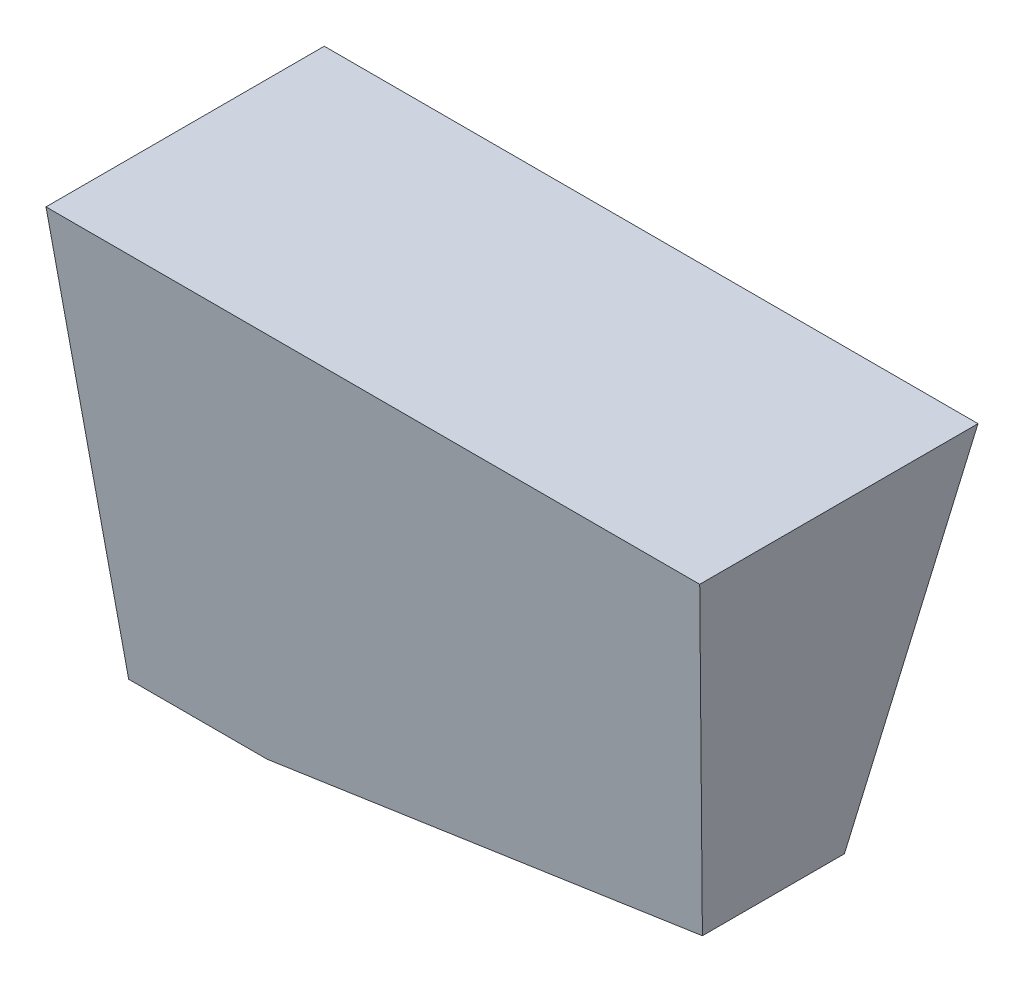
ISO-10303-21;
HEADER;
FILE_DESCRIPTION(('STEP AP214'),'2;1');
FILE_NAME('part.step','',(''),(''),'','','');
FILE_SCHEMA(('AUTOMOTIVE_DESIGN { 1 0 10303 214 1 1 1 1 }'));
ENDSEC;
DATA;
#1=APPLICATION_CONTEXT('core data for automotive mechanical design processes');
#2=APPLICATION_PROTOCOL_DEFINITION('international standard','automotive_design',2000,#1);
#3=PRODUCT_CONTEXT('',#1,'mechanical');
#4=PRODUCT('Part','Part','',(#3));
#5=PRODUCT_RELATED_PRODUCT_CATEGORY('part','',(#4));
#6=PRODUCT_DEFINITION_FORMATION('','',#4);
#7=PRODUCT_DEFINITION_CONTEXT('part definition',#1,'design');
#8=PRODUCT_DEFINITION('design','',#6,#7);
#9=PRODUCT_DEFINITION_SHAPE('','',#8);
#10=(LENGTH_UNIT() NAMED_UNIT(*) SI_UNIT(.MILLI.,.METRE.));
#11=(NAMED_UNIT(*) PLANE_ANGLE_UNIT() SI_UNIT($,.RADIAN.));
#12=(NAMED_UNIT(*) SI_UNIT($,.STERADIAN.) SOLID_ANGLE_UNIT());
#13=UNCERTAINTY_MEASURE_WITH_UNIT(LENGTH_MEASURE(1.E-05),#10,'distance_accuracy_value','');
#14=(GEOMETRIC_REPRESENTATION_CONTEXT(3) GLOBAL_UNCERTAINTY_ASSIGNED_CONTEXT((#13)) GLOBAL_UNIT_ASSIGNED_CONTEXT((#10,
#11,#12)) REPRESENTATION_CONTEXT('',''));
#15=CARTESIAN_POINT('',(0.,0.,0.));
#16=DIRECTION('',(0.,0.,1.));
#17=DIRECTION('',(1.,0.,0.));
#18=AXIS2_PLACEMENT_3D('',#15,#16,#17);
#19=CARTESIAN_POINT('',(0.,0.27922650273224,0.));
#20=DIRECTION('',(0.,1.,0.));
#21=DIRECTION('',(0.,0.,1.));
#22=AXIS2_PLACEMENT_3D('',#19,#20,#21);
#23=PLANE('',#22);
#24=DIRECTION('',(0.,0.,-1.));
#25=VECTOR('',#24,1.);
#26=CARTESIAN_POINT('',(-0.375500011,0.279226502732242,-0.802499919));
#27=LINE('',#26,#25);
#28=CARTESIAN_POINT('',(-0.375500011,0.279226502732242,0.0862477101703837));
#29=VERTEX_POINT('',#28);
#30=CARTESIAN_POINT('',(-0.375500011,0.279226502732238,-0.0862477101703828));
#31=VERTEX_POINT('',#30);
#32=EDGE_CURVE('E62',#29,#31,#27,.T.);
#33=ORIENTED_EDGE('',*,*,#32,.F.);
#34=DIRECTION('',(-1.,0.,0.));
#35=VECTOR('',#34,1.);
#36=CARTESIAN_POINT('',(38.0500475133969,0.27922650273224,0.0862477101703825));
#37=LINE('',#36,#35);
#38=CARTESIAN_POINT('',(0.029735205160561,0.27922650273224,0.086247710170384));
#39=VERTEX_POINT('',#38);
#40=EDGE_CURVE('E55',#39,#29,#37,.T.);
#41=ORIENTED_EDGE('',*,*,#40,.F.);
#42=DIRECTION('',(0.,0.,-1.));
#43=VECTOR('',#42,1.);
#44=CARTESIAN_POINT('',(0.0297352051605601,0.27922650273224,38.4530398741067));
#45=LINE('',#44,#43);
#46=CARTESIAN_POINT('',(0.029735205160561,0.279226502732241,-0.086247710170384));
#47=VERTEX_POINT('',#46);
#48=EDGE_CURVE('E12',#39,#47,#45,.T.);
#49=ORIENTED_EDGE('',*,*,#48,.T.);
#50=DIRECTION('',(1.,0.,0.));
#51=VECTOR('',#50,1.);
#52=CARTESIAN_POINT('',(38.0500475133969,0.27922650273224,-0.0862477101703825));
#53=LINE('',#52,#51);
#54=EDGE_CURVE('E98',#31,#47,#53,.T.);
#55=ORIENTED_EDGE('',*,*,#54,.F.);
#56=EDGE_LOOP('',(#33,#41,#49,#55));
#57=FACE_BOUND('',#56,.T.);
#58=ADVANCED_FACE('F40',(#57),#23,.T.);
#59=CARTESIAN_POINT('',(-0.375500011,29.999999944,-0.802499919));
#60=DIRECTION('',(-1.,0.,0.));
#61=DIRECTION('',(0.,0.,1.));
#62=AXIS2_PLACEMENT_3D('',#59,#60,#61);
#63=PLANE('',#62);
#64=DIRECTION('',(0.,0.983571470813386,0.180519145250561));
#65=VECTOR('',#64,1.);
#66=CARTESIAN_POINT('',(-0.375500011,28.873684055518,5.334312735952));
#67=LINE('',#66,#65);
#68=CARTESIAN_POINT('',(-0.375500011,0.,0.035000057));
#69=VERTEX_POINT('',#68);
#70=EDGE_CURVE('E122',#69,#29,#67,.T.);
#71=ORIENTED_EDGE('',*,*,#70,.T.);
#72=ORIENTED_EDGE('',*,*,#32,.T.);
#73=DIRECTION('',(0.,-0.983571470813386,0.180519145250561));
#74=VECTOR('',#73,1.);
#75=CARTESIAN_POINT('',(-0.375500011,29.1586573640868,-5.38661512536508));
#76=LINE('',#75,#74);
#77=CARTESIAN_POINT('',(-0.375500011,0.,-0.0350000570000004));
#78=VERTEX_POINT('',#77);
#79=EDGE_CURVE('E95',#31,#78,#76,.T.);
#80=ORIENTED_EDGE('',*,*,#79,.T.);
#81=DIRECTION('',(0.,0.,1.));
#82=VECTOR('',#81,1.);
#83=CARTESIAN_POINT('',(-0.375500011,0.,0.));
#84=LINE('',#83,#82);
#85=EDGE_CURVE('E119',#78,#69,#84,.T.);
#86=ORIENTED_EDGE('',*,*,#85,.T.);
#87=EDGE_LOOP('',(#71,#72,#80,#86));
#88=FACE_BOUND('',#87,.T.);
#89=ADVANCED_FACE('F130',(#88),#63,.T.);
#90=CARTESIAN_POINT('',(38.0500475133969,0.,0.035000057));
#91=DIRECTION('',(0.,-0.180519145250561,0.983571470813386));
#92=DIRECTION('',(0.,-0.983571470813386,-0.180519145250561));
#93=AXIS2_PLACEMENT_3D('',#90,#91,#92);
#94=PLANE('',#93);
#95=DIRECTION('',(-0.170879369159136,-0.96910505965995,-0.177864061960983));
#96=VECTOR('',#95,1.);
#97=CARTESIAN_POINT('',(1.09212164303836,6.304319393277,1.19205918491448));
#98=LINE('',#97,#96);
#99=CARTESIAN_POINT('',(-0.0108359627425943,0.0491359758024133,0.0440181961145565));
#100=VERTEX_POINT('',#99);
#101=EDGE_CURVE('E110',#39,#100,#98,.T.);
#102=ORIENTED_EDGE('',*,*,#101,.F.);
#103=ORIENTED_EDGE('',*,*,#40,.T.);
#104=ORIENTED_EDGE('',*,*,#70,.F.);
#105=DIRECTION('',(-1.,0.,0.));
#106=VECTOR('',#105,1.);
#107=CARTESIAN_POINT('',(38.0500475133969,0.,0.035000057));
#108=LINE('',#107,#106);
#109=CARTESIAN_POINT('',(-0.289499929000001,0.,0.035000057));
#110=VERTEX_POINT('',#109);
#111=EDGE_CURVE('E115',#110,#69,#108,.T.);
#112=ORIENTED_EDGE('',*,*,#111,.F.);
#113=DIRECTION('',(-0.984307987911224,-0.173560055595611,-0.0318542310502863));
#114=VECTOR('',#113,1.);
#115=CARTESIAN_POINT('',(36.8562389306627,6.54979597930945,1.23711256924349));
#116=LINE('',#115,#114);
#117=EDGE_CURVE('E112',#100,#110,#116,.T.);
#118=ORIENTED_EDGE('',*,*,#117,.F.);
#119=EDGE_LOOP('',(#102,#103,#104,#112,#118));
#120=FACE_BOUND('',#119,.T.);
#121=ADVANCED_FACE('F131',(#120),#94,.T.);
#122=CARTESIAN_POINT('',(38.0500475133969,0.,-0.035000057));
#123=DIRECTION('',(0.,-0.180519145250561,-0.983571470813386));
#124=DIRECTION('',(0.,0.983571470813386,-0.180519145250561));
#125=AXIS2_PLACEMENT_3D('',#122,#123,#124);
#126=PLANE('',#125);
#127=ORIENTED_EDGE('',*,*,#79,.F.);
#128=ORIENTED_EDGE('',*,*,#54,.T.);
#129=DIRECTION('',(0.170879369159136,0.96910505965995,-0.177864061960983));
#130=VECTOR('',#129,1.);
#131=CARTESIAN_POINT('',(1.09212164303836,6.304319393277,-1.19205918491448));
#132=LINE('',#131,#130);
#133=CARTESIAN_POINT('',(-0.0108359627425943,0.0491359758024133,-0.0440181961145565));
#134=VERTEX_POINT('',#133);
#135=EDGE_CURVE('E88',#134,#47,#132,.T.);
#136=ORIENTED_EDGE('',*,*,#135,.F.);
#137=DIRECTION('',(0.984307987911224,0.173560055595611,-0.0318542310502863));
#138=VECTOR('',#137,1.);
#139=CARTESIAN_POINT('',(36.8562389306627,6.54979597930945,-1.23711256924349));
#140=LINE('',#139,#138);
#141=CARTESIAN_POINT('',(-0.289499929000001,0.,-0.035000057));
#142=VERTEX_POINT('',#141);
#143=EDGE_CURVE('E48',#142,#134,#140,.T.);
#144=ORIENTED_EDGE('',*,*,#143,.F.);
#145=DIRECTION('',(-1.,0.,0.));
#146=VECTOR('',#145,1.);
#147=CARTESIAN_POINT('',(38.0500475133969,0.,-0.035000057));
#148=LINE('',#147,#146);
#149=EDGE_CURVE('E117',#142,#78,#148,.T.);
#150=ORIENTED_EDGE('',*,*,#149,.T.);
#151=EDGE_LOOP('',(#127,#128,#136,#144,#150));
#152=FACE_BOUND('',#151,.T.);
#153=ADVANCED_FACE('F99',(#152),#126,.T.);
#154=CARTESIAN_POINT('',(-0.0108359627425961,0.0491359758024139,38.4530398741067));
#155=DIRECTION('',(-0.984807753012208,0.173648177666931,0.));
#156=DIRECTION('',(-0.173648177666931,-0.984807753012208,0.));
#157=AXIS2_PLACEMENT_3D('',#154,#155,#156);
#158=PLANE('',#157);
#159=ORIENTED_EDGE('',*,*,#48,.F.);
#160=ORIENTED_EDGE('',*,*,#101,.T.);
#161=DIRECTION('',(0.,0.,-1.));
#162=VECTOR('',#161,1.);
#163=CARTESIAN_POINT('',(-0.0108359627425961,0.0491359758024139,38.4530398741067));
#164=LINE('',#163,#162);
#165=EDGE_CURVE('E92',#100,#134,#164,.T.);
#166=ORIENTED_EDGE('',*,*,#165,.T.);
#167=ORIENTED_EDGE('',*,*,#135,.T.);
#168=EDGE_LOOP('',(#159,#160,#166,#167));
#169=FACE_BOUND('',#168,.T.);
#170=ADVANCED_FACE('F90',(#169),#158,.F.);
#171=CARTESIAN_POINT('',(0.,0.,0.));
#172=DIRECTION('',(0.,1.,0.));
#173=DIRECTION('',(0.,0.,1.));
#174=AXIS2_PLACEMENT_3D('',#171,#172,#173);
#175=PLANE('',#174);
#176=DIRECTION('',(0.,0.,-1.));
#177=VECTOR('',#176,1.);
#178=CARTESIAN_POINT('',(-0.289499929,0.,38.4530398741067));
#179=LINE('',#178,#177);
#180=EDGE_CURVE('E107',#110,#142,#179,.T.);
#181=ORIENTED_EDGE('',*,*,#180,.F.);
#182=ORIENTED_EDGE('',*,*,#111,.T.);
#183=ORIENTED_EDGE('',*,*,#85,.F.);
#184=ORIENTED_EDGE('',*,*,#149,.F.);
#185=EDGE_LOOP('',(#181,#182,#183,#184));
#186=FACE_BOUND('',#185,.T.);
#187=ADVANCED_FACE('F42',(#186),#175,.F.);
#188=CARTESIAN_POINT('',(-0.289499929,0.,38.4530398741067));
#189=DIRECTION('',(-0.173648177666931,0.984807753012208,0.));
#190=DIRECTION('',(-0.984807753012208,-0.173648177666931,0.));
#191=AXIS2_PLACEMENT_3D('',#188,#189,#190);
#192=PLANE('',#191);
#193=ORIENTED_EDGE('',*,*,#165,.F.);
#194=ORIENTED_EDGE('',*,*,#117,.T.);
#195=ORIENTED_EDGE('',*,*,#180,.T.);
#196=ORIENTED_EDGE('',*,*,#143,.T.);
#197=EDGE_LOOP('',(#193,#194,#195,#196));
#198=FACE_BOUND('',#197,.T.);
#199=ADVANCED_FACE('F125',(#198),#192,.F.);
#200=CLOSED_SHELL('',(#58,#89,#121,#153,#170,#187,#199));
#201=MANIFOLD_SOLID_BREP('B2',#200);
#202=ADVANCED_BREP_SHAPE_REPRESENTATION('',(#18,#201),#14);
#203=SHAPE_DEFINITION_REPRESENTATION(#9,#202);
ENDSEC;
END-ISO-10303-21;
